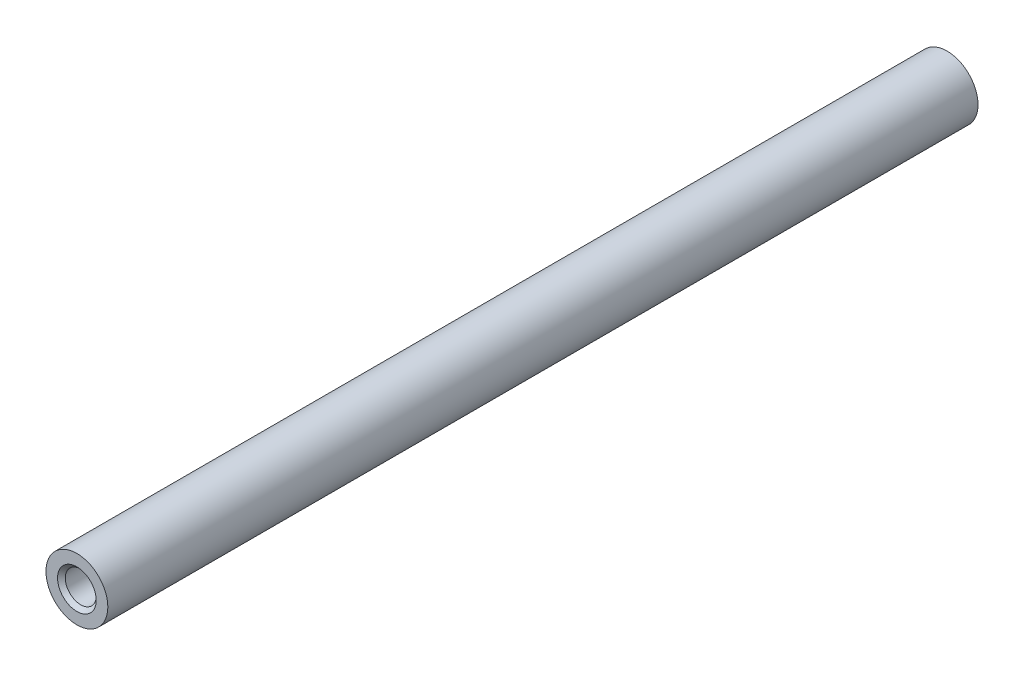
ISO-10303-21;
HEADER;
FILE_DESCRIPTION(('STEP AP214'),'2;1');
FILE_NAME('part.step','',(''),(''),'','','');
FILE_SCHEMA(('AUTOMOTIVE_DESIGN { 1 0 10303 214 1 1 1 1 }'));
ENDSEC;
DATA;
#1=APPLICATION_CONTEXT('core data for automotive mechanical design processes');
#2=APPLICATION_PROTOCOL_DEFINITION('international standard','automotive_design',2000,#1);
#3=PRODUCT_CONTEXT('',#1,'mechanical');
#4=PRODUCT('Part','Part','',(#3));
#5=PRODUCT_RELATED_PRODUCT_CATEGORY('part','',(#4));
#6=PRODUCT_DEFINITION_FORMATION('','',#4);
#7=PRODUCT_DEFINITION_CONTEXT('part definition',#1,'design');
#8=PRODUCT_DEFINITION('design','',#6,#7);
#9=PRODUCT_DEFINITION_SHAPE('','',#8);
#10=(LENGTH_UNIT() NAMED_UNIT(*) SI_UNIT(.MILLI.,.METRE.));
#11=(NAMED_UNIT(*) PLANE_ANGLE_UNIT() SI_UNIT($,.RADIAN.));
#12=(NAMED_UNIT(*) SI_UNIT($,.STERADIAN.) SOLID_ANGLE_UNIT());
#13=UNCERTAINTY_MEASURE_WITH_UNIT(LENGTH_MEASURE(1.E-05),#10,'distance_accuracy_value','');
#14=(GEOMETRIC_REPRESENTATION_CONTEXT(3) GLOBAL_UNCERTAINTY_ASSIGNED_CONTEXT((#13)) GLOBAL_UNIT_ASSIGNED_CONTEXT((#10,
#11,#12)) REPRESENTATION_CONTEXT('',''));
#15=CARTESIAN_POINT('',(0.,0.,0.));
#16=DIRECTION('',(0.,0.,1.));
#17=DIRECTION('',(1.,0.,0.));
#18=AXIS2_PLACEMENT_3D('',#15,#16,#17);
#19=CARTESIAN_POINT('',(0.,0.,112.5));
#20=DIRECTION('',(0.,0.,-1.));
#21=DIRECTION('',(-1.,0.,0.));
#22=AXIS2_PLACEMENT_3D('',#19,#20,#21);
#23=CYLINDRICAL_SURFACE('',#22,4.);
#24=CARTESIAN_POINT('',(0.,0.,111.5));
#25=DIRECTION('',(0.,0.,1.));
#26=DIRECTION('',(1.,0.,0.));
#27=AXIS2_PLACEMENT_3D('',#24,#25,#26);
#28=CIRCLE('',#27,4.);
#29=CARTESIAN_POINT('',(4.,0.,111.5));
#30=VERTEX_POINT('',#29);
#31=EDGE_CURVE('E43',#30,#30,#28,.T.);
#32=ORIENTED_EDGE('',*,*,#31,.T.);
#33=EDGE_LOOP('',(#32));
#34=FACE_BOUND('',#33,.T.);
#35=CARTESIAN_POINT('',(0.,0.,-82.5));
#36=DIRECTION('',(0.,0.,-1.));
#37=DIRECTION('',(-1.,0.,0.));
#38=AXIS2_PLACEMENT_3D('',#35,#36,#37);
#39=CIRCLE('',#38,4.);
#40=CARTESIAN_POINT('',(-4.,0.,-82.5));
#41=VERTEX_POINT('',#40);
#42=EDGE_CURVE('E54',#41,#41,#39,.T.);
#43=ORIENTED_EDGE('',*,*,#42,.T.);
#44=EDGE_LOOP('',(#43));
#45=FACE_BOUND('',#44,.T.);
#46=ADVANCED_FACE('F35',(#34,#45),#23,.F.);
#47=CARTESIAN_POINT('',(0.,0.,112.5));
#48=DIRECTION('',(0.,0.,1.));
#49=DIRECTION('',(1.,0.,0.));
#50=AXIS2_PLACEMENT_3D('',#47,#48,#49);
#51=PLANE('',#50);
#52=CARTESIAN_POINT('',(0.,0.,112.5));
#53=DIRECTION('',(0.,0.,1.));
#54=DIRECTION('',(1.,0.,0.));
#55=AXIS2_PLACEMENT_3D('',#52,#53,#54);
#56=CIRCLE('',#55,4.99999999999995);
#57=CARTESIAN_POINT('',(4.99999999999995,0.,112.5));
#58=VERTEX_POINT('',#57);
#59=EDGE_CURVE('E10',#58,#58,#56,.F.);
#60=ORIENTED_EDGE('',*,*,#59,.T.);
#61=EDGE_LOOP('',(#60));
#62=FACE_BOUND('',#61,.T.);
#63=CARTESIAN_POINT('',(0.,0.,112.5));
#64=DIRECTION('',(0.,0.,1.));
#65=DIRECTION('',(1.,0.,0.));
#66=AXIS2_PLACEMENT_3D('',#63,#64,#65);
#67=CIRCLE('',#66,8.);
#68=CARTESIAN_POINT('',(8.,0.,112.5));
#69=VERTEX_POINT('',#68);
#70=EDGE_CURVE('E47',#69,#69,#67,.T.);
#71=ORIENTED_EDGE('',*,*,#70,.T.);
#72=EDGE_LOOP('',(#71));
#73=FACE_BOUND('',#72,.T.);
#74=ADVANCED_FACE('F78',(#62,#73),#51,.T.);
#75=CARTESIAN_POINT('',(0.,0.,-112.5));
#76=DIRECTION('',(0.,0.,1.));
#77=DIRECTION('',(1.,0.,0.));
#78=AXIS2_PLACEMENT_3D('',#75,#76,#77);
#79=PLANE('',#78);
#80=CARTESIAN_POINT('',(0.,0.,-112.5));
#81=DIRECTION('',(0.,0.,-1.));
#82=DIRECTION('',(-1.,0.,0.));
#83=AXIS2_PLACEMENT_3D('',#80,#81,#82);
#84=CIRCLE('',#83,5.);
#85=CARTESIAN_POINT('',(-5.,0.,-112.5));
#86=VERTEX_POINT('',#85);
#87=EDGE_CURVE('E60',#86,#86,#84,.T.);
#88=ORIENTED_EDGE('',*,*,#87,.F.);
#89=EDGE_LOOP('',(#88));
#90=FACE_BOUND('',#89,.T.);
#91=CARTESIAN_POINT('',(0.,0.,-112.5));
#92=DIRECTION('',(0.,0.,1.));
#93=DIRECTION('',(1.,0.,0.));
#94=AXIS2_PLACEMENT_3D('',#91,#92,#93);
#95=CIRCLE('',#94,8.);
#96=CARTESIAN_POINT('',(8.,0.,-112.5));
#97=VERTEX_POINT('',#96);
#98=EDGE_CURVE('E51',#97,#97,#95,.T.);
#99=ORIENTED_EDGE('',*,*,#98,.F.);
#100=EDGE_LOOP('',(#99));
#101=FACE_BOUND('',#100,.T.);
#102=ADVANCED_FACE('F75',(#90,#101),#79,.F.);
#103=CARTESIAN_POINT('',(0.,0.,112.5));
#104=DIRECTION('',(0.,0.,-1.));
#105=DIRECTION('',(-1.,0.,0.));
#106=AXIS2_PLACEMENT_3D('',#103,#104,#105);
#107=CYLINDRICAL_SURFACE('',#106,8.);
#108=ORIENTED_EDGE('',*,*,#70,.F.);
#109=EDGE_LOOP('',(#108));
#110=FACE_BOUND('',#109,.T.);
#111=ORIENTED_EDGE('',*,*,#98,.T.);
#112=EDGE_LOOP('',(#111));
#113=FACE_BOUND('',#112,.T.);
#114=ADVANCED_FACE('F71',(#110,#113),#107,.T.);
#115=CARTESIAN_POINT('',(0.,0.,-82.5));
#116=DIRECTION('',(0.,0.,-1.));
#117=DIRECTION('',(-1.,0.,0.));
#118=AXIS2_PLACEMENT_3D('',#115,#116,#117);
#119=CYLINDRICAL_SURFACE('',#118,5.);
#120=CARTESIAN_POINT('',(0.,0.,-82.5));
#121=DIRECTION('',(0.,0.,-1.));
#122=DIRECTION('',(-1.,0.,0.));
#123=AXIS2_PLACEMENT_3D('',#120,#121,#122);
#124=CIRCLE('',#123,5.);
#125=CARTESIAN_POINT('',(-5.,0.,-82.5));
#126=VERTEX_POINT('',#125);
#127=EDGE_CURVE('E57',#126,#126,#124,.T.);
#128=ORIENTED_EDGE('',*,*,#127,.F.);
#129=EDGE_LOOP('',(#128));
#130=FACE_BOUND('',#129,.T.);
#131=ORIENTED_EDGE('',*,*,#87,.T.);
#132=EDGE_LOOP('',(#131));
#133=FACE_BOUND('',#132,.T.);
#134=ADVANCED_FACE('F68',(#130,#133),#119,.F.);
#135=CARTESIAN_POINT('',(0.,0.,-82.5));
#136=DIRECTION('',(0.,0.,-1.));
#137=DIRECTION('',(-1.,0.,0.));
#138=AXIS2_PLACEMENT_3D('',#135,#136,#137);
#139=PLANE('',#138);
#140=ORIENTED_EDGE('',*,*,#42,.F.);
#141=EDGE_LOOP('',(#140));
#142=FACE_BOUND('',#141,.T.);
#143=ORIENTED_EDGE('',*,*,#127,.T.);
#144=EDGE_LOOP('',(#143));
#145=FACE_BOUND('',#144,.T.);
#146=ADVANCED_FACE('F66',(#142,#145),#139,.T.);
#147=CARTESIAN_POINT('',(0.,0.,111.5));
#148=DIRECTION('',(0.,0.,1.));
#149=DIRECTION('',(1.,0.,0.));
#150=AXIS2_PLACEMENT_3D('',#147,#148,#149);
#151=CONICAL_SURFACE('',#150,4.,0.785398163397443);
#152=ORIENTED_EDGE('',*,*,#59,.F.);
#153=EDGE_LOOP('',(#152));
#154=FACE_BOUND('',#153,.T.);
#155=ORIENTED_EDGE('',*,*,#31,.F.);
#156=EDGE_LOOP('',(#155));
#157=FACE_BOUND('',#156,.T.);
#158=ADVANCED_FACE('F38',(#154,#157),#151,.F.);
#159=CLOSED_SHELL('',(#46,#74,#102,#114,#134,#146,#158));
#160=MANIFOLD_SOLID_BREP('B2',#159);
#161=ADVANCED_BREP_SHAPE_REPRESENTATION('',(#18,#160),#14);
#162=SHAPE_DEFINITION_REPRESENTATION(#9,#161);
ENDSEC;
END-ISO-10303-21;
